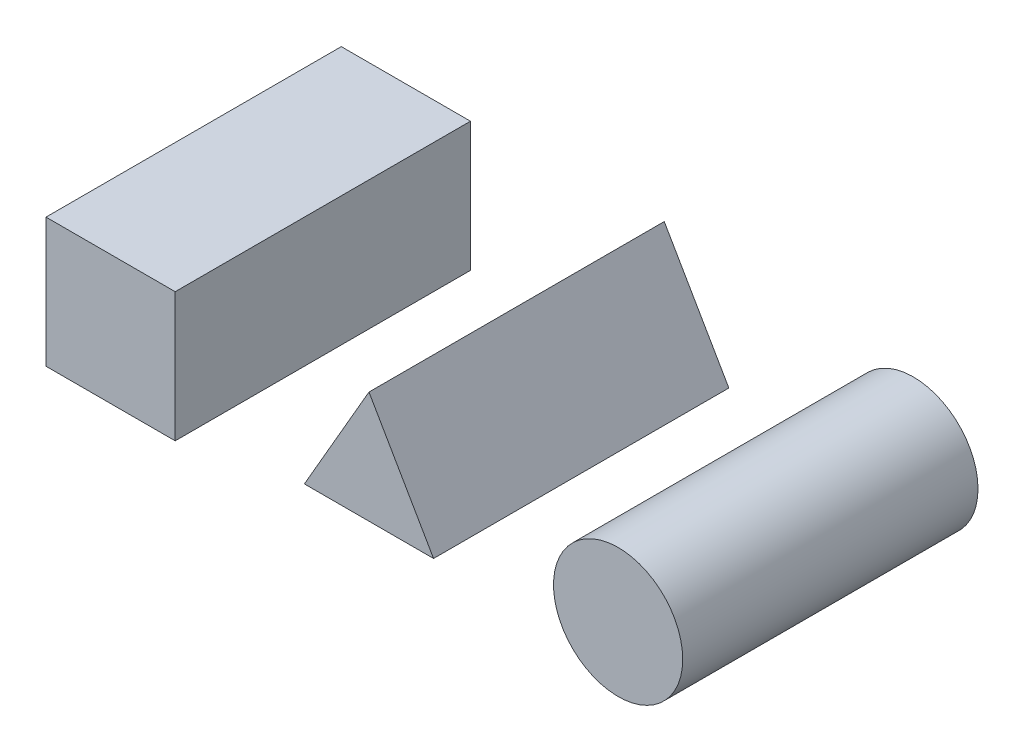
ISO-10303-21;
HEADER;
FILE_DESCRIPTION(('STEP AP214'),'2;1');
FILE_NAME('part.step','',(''),(''),'','','');
FILE_SCHEMA(('AUTOMOTIVE_DESIGN { 1 0 10303 214 1 1 1 1 }'));
ENDSEC;
DATA;
#1=APPLICATION_CONTEXT('core data for automotive mechanical design processes');
#2=APPLICATION_PROTOCOL_DEFINITION('international standard','automotive_design',2000,#1);
#3=PRODUCT_CONTEXT('',#1,'mechanical');
#4=PRODUCT('Part','Part','',(#3));
#5=PRODUCT_RELATED_PRODUCT_CATEGORY('part','',(#4));
#6=PRODUCT_DEFINITION_FORMATION('','',#4);
#7=PRODUCT_DEFINITION_CONTEXT('part definition',#1,'design');
#8=PRODUCT_DEFINITION('design','',#6,#7);
#9=PRODUCT_DEFINITION_SHAPE('','',#8);
#10=(LENGTH_UNIT() NAMED_UNIT(*) SI_UNIT(.MILLI.,.METRE.));
#11=(NAMED_UNIT(*) PLANE_ANGLE_UNIT() SI_UNIT($,.RADIAN.));
#12=(NAMED_UNIT(*) SI_UNIT($,.STERADIAN.) SOLID_ANGLE_UNIT());
#13=UNCERTAINTY_MEASURE_WITH_UNIT(LENGTH_MEASURE(1.E-05),#10,'distance_accuracy_value','');
#14=(GEOMETRIC_REPRESENTATION_CONTEXT(3) GLOBAL_UNCERTAINTY_ASSIGNED_CONTEXT((#13)) GLOBAL_UNIT_ASSIGNED_CONTEXT((#10,
#11,#12)) REPRESENTATION_CONTEXT('',''));
#15=CARTESIAN_POINT('',(0.,0.,0.));
#16=DIRECTION('',(0.,0.,1.));
#17=DIRECTION('',(1.,0.,0.));
#18=AXIS2_PLACEMENT_3D('',#15,#16,#17);
#19=CARTESIAN_POINT('',(67.5,0.,80.));
#20=DIRECTION('',(0.,0.,-1.));
#21=DIRECTION('',(-1.,0.,0.));
#22=AXIS2_PLACEMENT_3D('',#19,#20,#21);
#23=CYLINDRICAL_SURFACE('',#22,17.5);
#24=CARTESIAN_POINT('',(67.5,0.,80.));
#25=DIRECTION('',(0.,0.,1.));
#26=DIRECTION('',(1.,0.,0.));
#27=AXIS2_PLACEMENT_3D('',#24,#25,#26);
#28=CIRCLE('',#27,17.5);
#29=CARTESIAN_POINT('',(85.,0.,80.));
#30=VERTEX_POINT('',#29);
#31=EDGE_CURVE('E11',#30,#30,#28,.T.);
#32=ORIENTED_EDGE('',*,*,#31,.F.);
#33=EDGE_LOOP('',(#32));
#34=FACE_BOUND('',#33,.T.);
#35=CARTESIAN_POINT('',(67.5,0.,0.));
#36=DIRECTION('',(0.,0.,1.));
#37=DIRECTION('',(1.,0.,0.));
#38=AXIS2_PLACEMENT_3D('',#35,#36,#37);
#39=CIRCLE('',#38,17.5);
#40=CARTESIAN_POINT('',(85.,0.,0.));
#41=VERTEX_POINT('',#40);
#42=EDGE_CURVE('E53',#41,#41,#39,.T.);
#43=ORIENTED_EDGE('',*,*,#42,.T.);
#44=EDGE_LOOP('',(#43));
#45=FACE_BOUND('',#44,.T.);
#46=ADVANCED_FACE('F50',(#34,#45),#23,.T.);
#47=CARTESIAN_POINT('',(0.,0.,80.));
#48=DIRECTION('',(0.,0.,1.));
#49=DIRECTION('',(1.,0.,0.));
#50=AXIS2_PLACEMENT_3D('',#47,#48,#49);
#51=PLANE('',#50);
#52=ORIENTED_EDGE('',*,*,#31,.T.);
#53=EDGE_LOOP('',(#52));
#54=FACE_BOUND('',#53,.T.);
#55=ADVANCED_FACE('F65',(#54),#51,.T.);
#56=CARTESIAN_POINT('',(0.,0.,0.));
#57=DIRECTION('',(0.,0.,1.));
#58=DIRECTION('',(1.,0.,0.));
#59=AXIS2_PLACEMENT_3D('',#56,#57,#58);
#60=PLANE('',#59);
#61=ORIENTED_EDGE('',*,*,#42,.F.);
#62=EDGE_LOOP('',(#61));
#63=FACE_BOUND('',#62,.T.);
#64=ADVANCED_FACE('F63',(#63),#60,.F.);
#65=CLOSED_SHELL('',(#46,#55,#64));
#66=MANIFOLD_SOLID_BREP('B2',#65);
#67=CARTESIAN_POINT('',(-52.5,0.,80.));
#68=DIRECTION('',(1.,0.,0.));
#69=DIRECTION('',(0.,1.,0.));
#70=AXIS2_PLACEMENT_3D('',#67,#68,#69);
#71=PLANE('',#70);
#72=DIRECTION('',(0.,-1.,0.));
#73=VECTOR('',#72,1.);
#74=CARTESIAN_POINT('',(-52.5,0.,0.));
#75=LINE('',#74,#73);
#76=CARTESIAN_POINT('',(-52.5,17.4999999999999,0.));
#77=VERTEX_POINT('',#76);
#78=CARTESIAN_POINT('',(-52.5,-17.5000000000001,0.));
#79=VERTEX_POINT('',#78);
#80=EDGE_CURVE('E169',#77,#79,#75,.T.);
#81=ORIENTED_EDGE('',*,*,#80,.F.);
#82=DIRECTION('',(0.,0.,-1.));
#83=VECTOR('',#82,1.);
#84=CARTESIAN_POINT('',(-52.5,17.4999999999999,80.));
#85=LINE('',#84,#83);
#86=CARTESIAN_POINT('',(-52.5,17.4999999999999,80.));
#87=VERTEX_POINT('',#86);
#88=EDGE_CURVE('E48',#87,#77,#85,.T.);
#89=ORIENTED_EDGE('',*,*,#88,.F.);
#90=DIRECTION('',(0.,-1.,0.));
#91=VECTOR('',#90,1.);
#92=CARTESIAN_POINT('',(-52.5,0.,80.));
#93=LINE('',#92,#91);
#94=CARTESIAN_POINT('',(-52.5,-17.5000000000001,80.));
#95=VERTEX_POINT('',#94);
#96=EDGE_CURVE('E160',#87,#95,#93,.T.);
#97=ORIENTED_EDGE('',*,*,#96,.T.);
#98=DIRECTION('',(0.,0.,-1.));
#99=VECTOR('',#98,1.);
#100=CARTESIAN_POINT('',(-52.5,-17.5000000000001,80.));
#101=LINE('',#100,#99);
#102=EDGE_CURVE('E139',#95,#79,#101,.T.);
#103=ORIENTED_EDGE('',*,*,#102,.T.);
#104=EDGE_LOOP('',(#81,#89,#97,#103));
#105=FACE_BOUND('',#104,.T.);
#106=ADVANCED_FACE('F100',(#105),#71,.T.);
#107=CARTESIAN_POINT('',(0.,17.4999999999999,80.));
#108=DIRECTION('',(0.,1.,0.));
#109=DIRECTION('',(-1.,0.,0.));
#110=AXIS2_PLACEMENT_3D('',#107,#108,#109);
#111=PLANE('',#110);
#112=DIRECTION('',(1.,0.,0.));
#113=VECTOR('',#112,1.);
#114=CARTESIAN_POINT('',(0.,17.4999999999999,0.));
#115=LINE('',#114,#113);
#116=CARTESIAN_POINT('',(-87.5,17.4999999999999,0.));
#117=VERTEX_POINT('',#116);
#118=EDGE_CURVE('E152',#117,#77,#115,.T.);
#119=ORIENTED_EDGE('',*,*,#118,.F.);
#120=DIRECTION('',(0.,0.,-1.));
#121=VECTOR('',#120,1.);
#122=CARTESIAN_POINT('',(-87.5,17.4999999999999,80.));
#123=LINE('',#122,#121);
#124=CARTESIAN_POINT('',(-87.5,17.4999999999999,80.));
#125=VERTEX_POINT('',#124);
#126=EDGE_CURVE('E109',#125,#117,#123,.T.);
#127=ORIENTED_EDGE('',*,*,#126,.F.);
#128=DIRECTION('',(1.,0.,0.));
#129=VECTOR('',#128,1.);
#130=CARTESIAN_POINT('',(0.,17.4999999999999,80.));
#131=LINE('',#130,#129);
#132=EDGE_CURVE('E150',#125,#87,#131,.T.);
#133=ORIENTED_EDGE('',*,*,#132,.T.);
#134=ORIENTED_EDGE('',*,*,#88,.T.);
#135=EDGE_LOOP('',(#119,#127,#133,#134));
#136=FACE_BOUND('',#135,.T.);
#137=ADVANCED_FACE('F148',(#136),#111,.T.);
#138=CARTESIAN_POINT('',(-87.5,0.,80.));
#139=DIRECTION('',(1.,0.,0.));
#140=DIRECTION('',(0.,1.,0.));
#141=AXIS2_PLACEMENT_3D('',#138,#139,#140);
#142=PLANE('',#141);
#143=DIRECTION('',(0.,-1.,0.));
#144=VECTOR('',#143,1.);
#145=CARTESIAN_POINT('',(-87.5,0.,0.));
#146=LINE('',#145,#144);
#147=CARTESIAN_POINT('',(-87.5,-17.5000000000001,0.));
#148=VERTEX_POINT('',#147);
#149=EDGE_CURVE('E132',#117,#148,#146,.T.);
#150=ORIENTED_EDGE('',*,*,#149,.T.);
#151=DIRECTION('',(0.,0.,-1.));
#152=VECTOR('',#151,1.);
#153=CARTESIAN_POINT('',(-87.5,-17.5000000000001,80.));
#154=LINE('',#153,#152);
#155=CARTESIAN_POINT('',(-87.5,-17.5000000000001,80.));
#156=VERTEX_POINT('',#155);
#157=EDGE_CURVE('E154',#156,#148,#154,.T.);
#158=ORIENTED_EDGE('',*,*,#157,.F.);
#159=DIRECTION('',(0.,-1.,0.));
#160=VECTOR('',#159,1.);
#161=CARTESIAN_POINT('',(-87.5,0.,80.));
#162=LINE('',#161,#160);
#163=EDGE_CURVE('E155',#125,#156,#162,.T.);
#164=ORIENTED_EDGE('',*,*,#163,.F.);
#165=ORIENTED_EDGE('',*,*,#126,.T.);
#166=EDGE_LOOP('',(#150,#158,#164,#165));
#167=FACE_BOUND('',#166,.T.);
#168=ADVANCED_FACE('F156',(#167),#142,.F.);
#169=CARTESIAN_POINT('',(0.,-17.5000000000001,80.));
#170=DIRECTION('',(0.,1.,0.));
#171=DIRECTION('',(-1.,0.,0.));
#172=AXIS2_PLACEMENT_3D('',#169,#170,#171);
#173=PLANE('',#172);
#174=DIRECTION('',(1.,0.,0.));
#175=VECTOR('',#174,1.);
#176=CARTESIAN_POINT('',(0.,-17.5000000000001,0.));
#177=LINE('',#176,#175);
#178=EDGE_CURVE('E164',#148,#79,#177,.T.);
#179=ORIENTED_EDGE('',*,*,#178,.T.);
#180=ORIENTED_EDGE('',*,*,#102,.F.);
#181=DIRECTION('',(1.,0.,0.));
#182=VECTOR('',#181,1.);
#183=CARTESIAN_POINT('',(0.,-17.5000000000001,80.));
#184=LINE('',#183,#182);
#185=EDGE_CURVE('E117',#156,#95,#184,.T.);
#186=ORIENTED_EDGE('',*,*,#185,.F.);
#187=ORIENTED_EDGE('',*,*,#157,.T.);
#188=EDGE_LOOP('',(#179,#180,#186,#187));
#189=FACE_BOUND('',#188,.T.);
#190=ADVANCED_FACE('F184',(#189),#173,.F.);
#191=CARTESIAN_POINT('',(0.,0.,80.));
#192=DIRECTION('',(0.,0.,1.));
#193=DIRECTION('',(1.,0.,0.));
#194=AXIS2_PLACEMENT_3D('',#191,#192,#193);
#195=PLANE('',#194);
#196=ORIENTED_EDGE('',*,*,#96,.F.);
#197=ORIENTED_EDGE('',*,*,#132,.F.);
#198=ORIENTED_EDGE('',*,*,#163,.T.);
#199=ORIENTED_EDGE('',*,*,#185,.T.);
#200=EDGE_LOOP('',(#196,#197,#198,#199));
#201=FACE_BOUND('',#200,.T.);
#202=ADVANCED_FACE('F159',(#201),#195,.T.);
#203=CARTESIAN_POINT('',(0.,0.,0.));
#204=DIRECTION('',(0.,0.,1.));
#205=DIRECTION('',(1.,0.,0.));
#206=AXIS2_PLACEMENT_3D('',#203,#204,#205);
#207=PLANE('',#206);
#208=ORIENTED_EDGE('',*,*,#80,.T.);
#209=ORIENTED_EDGE('',*,*,#178,.F.);
#210=ORIENTED_EDGE('',*,*,#149,.F.);
#211=ORIENTED_EDGE('',*,*,#118,.T.);
#212=EDGE_LOOP('',(#208,#209,#210,#211));
#213=FACE_BOUND('',#212,.T.);
#214=ADVANCED_FACE('F186',(#213),#207,.F.);
#215=CLOSED_SHELL('',(#106,#137,#168,#190,#202,#214));
#216=MANIFOLD_SOLID_BREP('B6',#215);
#217=CARTESIAN_POINT('',(0.,-10.1036297108185,80.));
#218=DIRECTION('',(0.,-1.,0.));
#219=DIRECTION('',(1.,0.,0.));
#220=AXIS2_PLACEMENT_3D('',#217,#218,#219);
#221=PLANE('',#220);
#222=DIRECTION('',(-1.,0.,0.));
#223=VECTOR('',#222,1.);
#224=CARTESIAN_POINT('',(0.,-10.1036297108185,0.));
#225=LINE('',#224,#223);
#226=CARTESIAN_POINT('',(17.5,-10.1036297108185,0.));
#227=VERTEX_POINT('',#226);
#228=CARTESIAN_POINT('',(-17.5,-10.1036297108185,0.));
#229=VERTEX_POINT('',#228);
#230=EDGE_CURVE('E270',#227,#229,#225,.T.);
#231=ORIENTED_EDGE('',*,*,#230,.F.);
#232=DIRECTION('',(0.,0.,-1.));
#233=VECTOR('',#232,1.);
#234=CARTESIAN_POINT('',(17.5,-10.1036297108185,80.));
#235=LINE('',#234,#233);
#236=CARTESIAN_POINT('',(17.5,-10.1036297108185,80.));
#237=VERTEX_POINT('',#236);
#238=EDGE_CURVE('E98',#237,#227,#235,.T.);
#239=ORIENTED_EDGE('',*,*,#238,.F.);
#240=DIRECTION('',(-1.,0.,0.));
#241=VECTOR('',#240,1.);
#242=CARTESIAN_POINT('',(0.,-10.1036297108185,80.));
#243=LINE('',#242,#241);
#244=CARTESIAN_POINT('',(-17.5,-10.1036297108185,80.));
#245=VERTEX_POINT('',#244);
#246=EDGE_CURVE('E268',#237,#245,#243,.T.);
#247=ORIENTED_EDGE('',*,*,#246,.T.);
#248=DIRECTION('',(0.,0.,-1.));
#249=VECTOR('',#248,1.);
#250=CARTESIAN_POINT('',(-17.5,-10.1036297108185,80.));
#251=LINE('',#250,#249);
#252=EDGE_CURVE('E252',#245,#229,#251,.T.);
#253=ORIENTED_EDGE('',*,*,#252,.T.);
#254=EDGE_LOOP('',(#231,#239,#247,#253));
#255=FACE_BOUND('',#254,.T.);
#256=ADVANCED_FACE('F236',(#255),#221,.T.);
#257=CARTESIAN_POINT('',(8.74999999999996,5.0518148554092,80.));
#258=DIRECTION('',(0.866025403784438,0.5,0.));
#259=DIRECTION('',(-0.5,0.866025403784438,0.));
#260=AXIS2_PLACEMENT_3D('',#257,#258,#259);
#261=PLANE('',#260);
#262=DIRECTION('',(0.5,-0.866025403784439,0.));
#263=VECTOR('',#262,1.);
#264=CARTESIAN_POINT('',(8.74999999999996,5.0518148554092,0.));
#265=LINE('',#264,#263);
#266=CARTESIAN_POINT('',(0.,20.2072594216368,0.));
#267=VERTEX_POINT('',#266);
#268=EDGE_CURVE('E286',#267,#227,#265,.T.);
#269=ORIENTED_EDGE('',*,*,#268,.F.);
#270=DIRECTION('',(0.,0.,-1.));
#271=VECTOR('',#270,1.);
#272=CARTESIAN_POINT('',(0.,20.2072594216368,80.));
#273=LINE('',#272,#271);
#274=CARTESIAN_POINT('',(0.,20.2072594216368,80.));
#275=VERTEX_POINT('',#274);
#276=EDGE_CURVE('E244',#275,#267,#273,.T.);
#277=ORIENTED_EDGE('',*,*,#276,.F.);
#278=DIRECTION('',(0.5,-0.866025403784439,0.));
#279=VECTOR('',#278,1.);
#280=CARTESIAN_POINT('',(8.74999999999996,5.0518148554092,80.));
#281=LINE('',#280,#279);
#282=EDGE_CURVE('E277',#275,#237,#281,.T.);
#283=ORIENTED_EDGE('',*,*,#282,.T.);
#284=ORIENTED_EDGE('',*,*,#238,.T.);
#285=EDGE_LOOP('',(#269,#277,#283,#284));
#286=FACE_BOUND('',#285,.T.);
#287=ADVANCED_FACE('F281',(#286),#261,.T.);
#288=CARTESIAN_POINT('',(-8.74999999999997,5.0518148554092,80.));
#289=DIRECTION('',(-0.866025403784439,0.5,0.));
#290=DIRECTION('',(-0.5,-0.866025403784439,0.));
#291=AXIS2_PLACEMENT_3D('',#288,#289,#290);
#292=PLANE('',#291);
#293=DIRECTION('',(0.5,0.866025403784439,0.));
#294=VECTOR('',#293,1.);
#295=CARTESIAN_POINT('',(-8.74999999999997,5.0518148554092,0.));
#296=LINE('',#295,#294);
#297=EDGE_CURVE('E279',#229,#267,#296,.T.);
#298=ORIENTED_EDGE('',*,*,#297,.F.);
#299=ORIENTED_EDGE('',*,*,#252,.F.);
#300=DIRECTION('',(0.5,0.866025403784439,0.));
#301=VECTOR('',#300,1.);
#302=CARTESIAN_POINT('',(-8.74999999999997,5.0518148554092,80.));
#303=LINE('',#302,#301);
#304=EDGE_CURVE('E278',#245,#275,#303,.T.);
#305=ORIENTED_EDGE('',*,*,#304,.T.);
#306=ORIENTED_EDGE('',*,*,#276,.T.);
#307=EDGE_LOOP('',(#298,#299,#305,#306));
#308=FACE_BOUND('',#307,.T.);
#309=ADVANCED_FACE('F292',(#308),#292,.T.);
#310=CARTESIAN_POINT('',(0.,0.,80.));
#311=DIRECTION('',(0.,0.,1.));
#312=DIRECTION('',(1.,0.,0.));
#313=AXIS2_PLACEMENT_3D('',#310,#311,#312);
#314=PLANE('',#313);
#315=ORIENTED_EDGE('',*,*,#246,.F.);
#316=ORIENTED_EDGE('',*,*,#282,.F.);
#317=ORIENTED_EDGE('',*,*,#304,.F.);
#318=EDGE_LOOP('',(#315,#316,#317));
#319=FACE_BOUND('',#318,.T.);
#320=ADVANCED_FACE('F276',(#319),#314,.T.);
#321=CARTESIAN_POINT('',(0.,0.,0.));
#322=DIRECTION('',(0.,0.,1.));
#323=DIRECTION('',(1.,0.,0.));
#324=AXIS2_PLACEMENT_3D('',#321,#322,#323);
#325=PLANE('',#324);
#326=ORIENTED_EDGE('',*,*,#230,.T.);
#327=ORIENTED_EDGE('',*,*,#297,.T.);
#328=ORIENTED_EDGE('',*,*,#268,.T.);
#329=EDGE_LOOP('',(#326,#327,#328));
#330=FACE_BOUND('',#329,.T.);
#331=ADVANCED_FACE('F291',(#330),#325,.F.);
#332=CLOSED_SHELL('',(#256,#287,#309,#320,#331));
#333=MANIFOLD_SOLID_BREP('B42',#332);
#334=ADVANCED_BREP_SHAPE_REPRESENTATION('',(#18,#66,#216,#333),#14);
#335=SHAPE_DEFINITION_REPRESENTATION(#9,#334);
ENDSEC;
END-ISO-10303-21;
